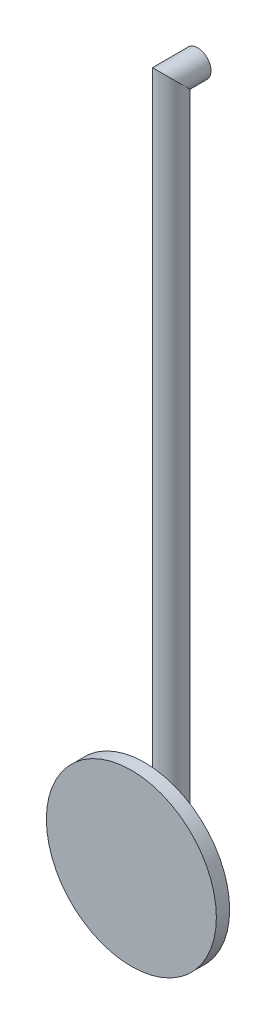
ISO-10303-21;
HEADER;
FILE_DESCRIPTION(('STEP AP214'),'2;1');
FILE_NAME('part.step','',(''),(''),'','','');
FILE_SCHEMA(('AUTOMOTIVE_DESIGN { 1 0 10303 214 1 1 1 1 }'));
ENDSEC;
DATA;
#1=APPLICATION_CONTEXT('core data for automotive mechanical design processes');
#2=APPLICATION_PROTOCOL_DEFINITION('international standard','automotive_design',2000,#1);
#3=PRODUCT_CONTEXT('',#1,'mechanical');
#4=PRODUCT('Part','Part','',(#3));
#5=PRODUCT_RELATED_PRODUCT_CATEGORY('part','',(#4));
#6=PRODUCT_DEFINITION_FORMATION('','',#4);
#7=PRODUCT_DEFINITION_CONTEXT('part definition',#1,'design');
#8=PRODUCT_DEFINITION('design','',#6,#7);
#9=PRODUCT_DEFINITION_SHAPE('','',#8);
#10=(LENGTH_UNIT() NAMED_UNIT(*) SI_UNIT(.MILLI.,.METRE.));
#11=(NAMED_UNIT(*) PLANE_ANGLE_UNIT() SI_UNIT($,.RADIAN.));
#12=(NAMED_UNIT(*) SI_UNIT($,.STERADIAN.) SOLID_ANGLE_UNIT());
#13=UNCERTAINTY_MEASURE_WITH_UNIT(LENGTH_MEASURE(1.E-05),#10,'distance_accuracy_value','');
#14=(GEOMETRIC_REPRESENTATION_CONTEXT(3) GLOBAL_UNCERTAINTY_ASSIGNED_CONTEXT((#13)) GLOBAL_UNIT_ASSIGNED_CONTEXT((#10,
#11,#12)) REPRESENTATION_CONTEXT('',''));
#15=CARTESIAN_POINT('',(0.,0.,0.));
#16=DIRECTION('',(0.,0.,1.));
#17=DIRECTION('',(1.,0.,0.));
#18=AXIS2_PLACEMENT_3D('',#15,#16,#17);
#19=CARTESIAN_POINT('',(0.,0.,-5.));
#20=DIRECTION('',(0.,0.,1.));
#21=DIRECTION('',(1.,0.,0.));
#22=AXIS2_PLACEMENT_3D('',#19,#20,#21);
#23=CYLINDRICAL_SURFACE('',#22,32.);
#24=CARTESIAN_POINT('',(0.,0.,-5.));
#25=DIRECTION('',(0.,0.,1.));
#26=DIRECTION('',(1.,0.,0.));
#27=AXIS2_PLACEMENT_3D('',#24,#25,#26);
#28=CIRCLE('',#27,32.);
#29=CARTESIAN_POINT('',(32.,0.,-5.));
#30=VERTEX_POINT('',#29);
#31=EDGE_CURVE('E11',#30,#30,#28,.T.);
#32=ORIENTED_EDGE('',*,*,#31,.T.);
#33=EDGE_LOOP('',(#32));
#34=FACE_BOUND('',#33,.T.);
#35=CARTESIAN_POINT('',(0.,0.,0.));
#36=DIRECTION('',(0.,0.,1.));
#37=DIRECTION('',(1.,0.,0.));
#38=AXIS2_PLACEMENT_3D('',#35,#36,#37);
#39=CIRCLE('',#38,32.);
#40=CARTESIAN_POINT('',(32.,0.,0.));
#41=VERTEX_POINT('',#40);
#42=EDGE_CURVE('E39',#41,#41,#39,.T.);
#43=ORIENTED_EDGE('',*,*,#42,.F.);
#44=EDGE_LOOP('',(#43));
#45=FACE_BOUND('',#44,.T.);
#46=ADVANCED_FACE('F36',(#34,#45),#23,.T.);
#47=CARTESIAN_POINT('',(0.,0.,-5.));
#48=DIRECTION('',(0.,0.,1.));
#49=DIRECTION('',(1.,0.,0.));
#50=AXIS2_PLACEMENT_3D('',#47,#48,#49);
#51=PLANE('',#50);
#52=CARTESIAN_POINT('',(0.,0.,-5.));
#53=DIRECTION('',(0.,0.,1.));
#54=DIRECTION('',(1.,0.,0.));
#55=AXIS2_PLACEMENT_3D('',#52,#53,#54);
#56=CIRCLE('',#55,5.);
#57=CARTESIAN_POINT('',(5.,0.,-5.));
#58=VERTEX_POINT('',#57);
#59=EDGE_CURVE('E61',#58,#58,#56,.T.);
#60=ORIENTED_EDGE('',*,*,#59,.T.);
#61=EDGE_LOOP('',(#60));
#62=FACE_BOUND('',#61,.T.);
#63=ORIENTED_EDGE('',*,*,#31,.F.);
#64=EDGE_LOOP('',(#63));
#65=FACE_BOUND('',#64,.T.);
#66=ADVANCED_FACE('F83',(#62,#65),#51,.F.);
#67=CARTESIAN_POINT('',(0.,0.,0.));
#68=DIRECTION('',(0.,0.,1.));
#69=DIRECTION('',(1.,0.,0.));
#70=AXIS2_PLACEMENT_3D('',#67,#68,#69);
#71=PLANE('',#70);
#72=ORIENTED_EDGE('',*,*,#42,.T.);
#73=EDGE_LOOP('',(#72));
#74=FACE_BOUND('',#73,.T.);
#75=ADVANCED_FACE('F79',(#74),#71,.T.);
#76=CARTESIAN_POINT('',(0.,250.,-25.));
#77=DIRECTION('',(0.,0.,1.));
#78=DIRECTION('',(1.,0.,0.));
#79=AXIS2_PLACEMENT_3D('',#76,#77,#78);
#80=PLANE('',#79);
#81=CARTESIAN_POINT('',(0.,250.,-25.));
#82=DIRECTION('',(0.,0.,1.));
#83=DIRECTION('',(1.,0.,0.));
#84=AXIS2_PLACEMENT_3D('',#81,#82,#83);
#85=CIRCLE('',#84,5.);
#86=CARTESIAN_POINT('',(5.,250.,-25.));
#87=VERTEX_POINT('',#86);
#88=EDGE_CURVE('E48',#87,#87,#85,.T.);
#89=ORIENTED_EDGE('',*,*,#88,.F.);
#90=EDGE_LOOP('',(#89));
#91=FACE_BOUND('',#90,.T.);
#92=ADVANCED_FACE('F72',(#91),#80,.F.);
#93=CARTESIAN_POINT('',(0.,250.,-3.90000000000005));
#94=DIRECTION('',(0.,0.,-1.));
#95=DIRECTION('',(-1.,0.,0.));
#96=AXIS2_PLACEMENT_3D('',#93,#94,#95);
#97=CYLINDRICAL_SURFACE('',#96,5.);
#98=CARTESIAN_POINT('',(0.,250.,-15.));
#99=DIRECTION('',(0.,0.707106781186548,-0.707106781186548));
#100=DIRECTION('',(0.,0.707106781186548,0.707106781186548));
#101=AXIS2_PLACEMENT_3D('',#98,#99,#100);
#102=ELLIPSE('',#101,7.07106781186547,5.);
#103=CARTESIAN_POINT('',(0.,255.,-10.));
#104=VERTEX_POINT('',#103);
#105=EDGE_CURVE('E53',#104,#104,#102,.T.);
#106=ORIENTED_EDGE('',*,*,#105,.T.);
#107=EDGE_LOOP('',(#106));
#108=FACE_BOUND('',#107,.T.);
#109=ORIENTED_EDGE('',*,*,#88,.T.);
#110=EDGE_LOOP('',(#109));
#111=FACE_BOUND('',#110,.T.);
#112=ADVANCED_FACE('F69',(#108,#111),#97,.T.);
#113=CARTESIAN_POINT('',(0.,-11.1,-15.));
#114=DIRECTION('',(0.,1.,0.));
#115=DIRECTION('',(0.,0.,1.));
#116=AXIS2_PLACEMENT_3D('',#113,#114,#115);
#117=CYLINDRICAL_SURFACE('',#116,5.);
#118=CARTESIAN_POINT('',(0.,0.,-15.));
#119=DIRECTION('',(0.,0.707106781186547,-0.707106781186547));
#120=DIRECTION('',(0.,-0.707106781186548,-0.707106781186548));
#121=AXIS2_PLACEMENT_3D('',#118,#119,#120);
#122=ELLIPSE('',#121,7.07106781186548,5.);
#123=CARTESIAN_POINT('',(0.,-5.,-20.));
#124=VERTEX_POINT('',#123);
#125=EDGE_CURVE('E58',#124,#124,#122,.T.);
#126=ORIENTED_EDGE('',*,*,#125,.T.);
#127=EDGE_LOOP('',(#126));
#128=FACE_BOUND('',#127,.T.);
#129=ORIENTED_EDGE('',*,*,#105,.F.);
#130=EDGE_LOOP('',(#129));
#131=FACE_BOUND('',#130,.T.);
#132=ADVANCED_FACE('F71',(#128,#131),#117,.T.);
#133=CARTESIAN_POINT('',(0.,0.,-5.));
#134=DIRECTION('',(0.,0.,-1.));
#135=DIRECTION('',(-1.,0.,0.));
#136=AXIS2_PLACEMENT_3D('',#133,#134,#135);
#137=CYLINDRICAL_SURFACE('',#136,5.);
#138=ORIENTED_EDGE('',*,*,#59,.F.);
#139=EDGE_LOOP('',(#138));
#140=FACE_BOUND('',#139,.T.);
#141=ORIENTED_EDGE('',*,*,#125,.F.);
#142=EDGE_LOOP('',(#141));
#143=FACE_BOUND('',#142,.T.);
#144=ADVANCED_FACE('F59',(#140,#143),#137,.T.);
#145=CLOSED_SHELL('',(#46,#66,#75,#92,#112,#132,#144));
#146=MANIFOLD_SOLID_BREP('B2',#145);
#147=ADVANCED_BREP_SHAPE_REPRESENTATION('',(#18,#146),#14);
#148=SHAPE_DEFINITION_REPRESENTATION(#9,#147);
ENDSEC;
END-ISO-10303-21;
